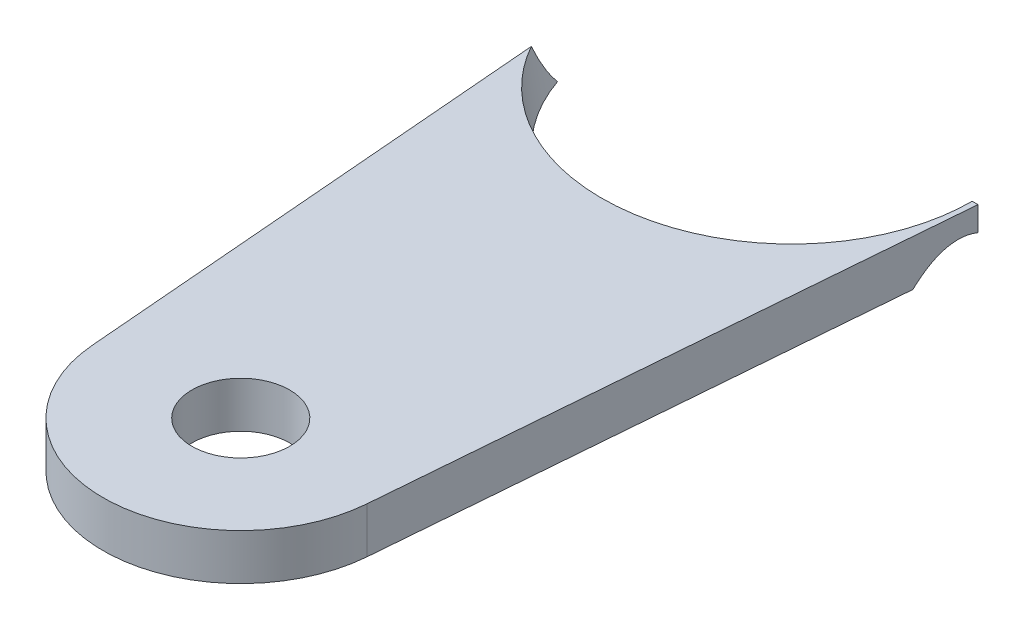
ISO-10303-21;
HEADER;
FILE_DESCRIPTION(('STEP AP214'),'2;1');
FILE_NAME('part.step','',(''),(''),'','','');
FILE_SCHEMA(('AUTOMOTIVE_DESIGN { 1 0 10303 214 1 1 1 1 }'));
ENDSEC;
DATA;
#1=APPLICATION_CONTEXT('core data for automotive mechanical design processes');
#2=APPLICATION_PROTOCOL_DEFINITION('international standard','automotive_design',2000,#1);
#3=PRODUCT_CONTEXT('',#1,'mechanical');
#4=PRODUCT('Part','Part','',(#3));
#5=PRODUCT_RELATED_PRODUCT_CATEGORY('part','',(#4));
#6=PRODUCT_DEFINITION_FORMATION('','',#4);
#7=PRODUCT_DEFINITION_CONTEXT('part definition',#1,'design');
#8=PRODUCT_DEFINITION('design','',#6,#7);
#9=PRODUCT_DEFINITION_SHAPE('','',#8);
#10=(LENGTH_UNIT() NAMED_UNIT(*) SI_UNIT(.MILLI.,.METRE.));
#11=(NAMED_UNIT(*) PLANE_ANGLE_UNIT() SI_UNIT($,.RADIAN.));
#12=(NAMED_UNIT(*) SI_UNIT($,.STERADIAN.) SOLID_ANGLE_UNIT());
#13=UNCERTAINTY_MEASURE_WITH_UNIT(LENGTH_MEASURE(1.E-05),#10,'distance_accuracy_value','');
#14=(GEOMETRIC_REPRESENTATION_CONTEXT(3) GLOBAL_UNCERTAINTY_ASSIGNED_CONTEXT((#13)) GLOBAL_UNIT_ASSIGNED_CONTEXT((#10,
#11,#12)) REPRESENTATION_CONTEXT('',''));
#15=CARTESIAN_POINT('',(0.,0.,0.));
#16=DIRECTION('',(0.,0.,1.));
#17=DIRECTION('',(1.,0.,0.));
#18=AXIS2_PLACEMENT_3D('',#15,#16,#17);
#19=CARTESIAN_POINT('',(0.,3.175,-38.2665732));
#20=DIRECTION('',(0.,0.,1.));
#21=DIRECTION('',(-1.,0.,0.));
#22=AXIS2_PLACEMENT_3D('',#19,#20,#21);
#23=PLANE('',#22);
#24=CARTESIAN_POINT('',(0.0470558137914412,-0.196820951831489,-38.2665732));
#25=DIRECTION('',(0.,0.,-1.));
#26=DIRECTION('',(0.232526162396845,-0.972590141735457,0.));
#27=AXIS2_PLACEMENT_3D('',#24,#25,#26);
#28=ELLIPSE('',#27,575.908131206146,12.7);
#29=CARTESIAN_POINT('',(12.7,1.49692016372004,-38.2665732));
#30=VERTEX_POINT('',#29);
#31=CARTESIAN_POINT('',(12.298835215549,3.175,-38.2665732));
#32=VERTEX_POINT('',#31);
#33=EDGE_CURVE('E11',#30,#32,#28,.F.);
#34=ORIENTED_EDGE('',*,*,#33,.T.);
#35=DIRECTION('',(1.,0.,0.));
#36=VECTOR('',#35,1.);
#37=CARTESIAN_POINT('',(0.,3.175,-38.2665732));
#38=LINE('',#37,#36);
#39=CARTESIAN_POINT('',(12.7,3.175,-38.2665732));
#40=VERTEX_POINT('',#39);
#41=EDGE_CURVE('E50',#32,#40,#38,.T.);
#42=ORIENTED_EDGE('',*,*,#41,.T.);
#43=DIRECTION('',(0.,-1.,0.));
#44=VECTOR('',#43,1.);
#45=CARTESIAN_POINT('',(12.7,3.175,-38.2665732));
#46=LINE('',#45,#44);
#47=EDGE_CURVE('E109',#40,#30,#46,.T.);
#48=ORIENTED_EDGE('',*,*,#47,.T.);
#49=EDGE_LOOP('',(#34,#42,#48));
#50=FACE_BOUND('',#49,.T.);
#51=ADVANCED_FACE('F47',(#50),#23,.F.);
#52=CARTESIAN_POINT('',(-9.49303504613389,3.175,0.779686227192671));
#53=DIRECTION('',(-0.996644099331641,0.,0.0818568217525113));
#54=DIRECTION('',(-0.0818568217525113,0.,-0.996644099331641));
#55=AXIS2_PLACEMENT_3D('',#52,#53,#54);
#56=PLANE('',#55);
#57=DIRECTION('',(0.0818568217525113,0.,0.996644099331641));
#58=VECTOR('',#57,1.);
#59=CARTESIAN_POINT('',(-9.49303504613389,0.,0.779686227192671));
#60=LINE('',#59,#58);
#61=CARTESIAN_POINT('',(-12.371838673831,0.,-34.2710595414799));
#62=VERTEX_POINT('',#61);
#63=CARTESIAN_POINT('',(-9.49303504613388,0.,0.779686227192673));
#64=VERTEX_POINT('',#63);
#65=EDGE_CURVE('E128',#62,#64,#60,.T.);
#66=ORIENTED_EDGE('',*,*,#65,.T.);
#67=DIRECTION('',(0.,-1.,0.));
#68=VECTOR('',#67,1.);
#69=CARTESIAN_POINT('',(-9.49303504613388,3.175,0.779686227192673));
#70=LINE('',#69,#68);
#71=CARTESIAN_POINT('',(-9.49303504613388,3.175,0.779686227192673));
#72=VERTEX_POINT('',#71);
#73=EDGE_CURVE('E132',#72,#64,#70,.T.);
#74=ORIENTED_EDGE('',*,*,#73,.F.);
#75=DIRECTION('',(0.0818568217525113,0.,0.996644099331641));
#76=VECTOR('',#75,1.);
#77=CARTESIAN_POINT('',(-9.49303504613389,3.175,0.779686227192671));
#78=LINE('',#77,#76);
#79=CARTESIAN_POINT('',(-12.2096075175305,3.175,-32.2958212999629));
#80=VERTEX_POINT('',#79);
#81=EDGE_CURVE('E123',#80,#72,#78,.T.);
#82=ORIENTED_EDGE('',*,*,#81,.F.);
#83=CARTESIAN_POINT('',(-12.8000934964319,53.5391141349132,-39.4852571222996));
#84=DIRECTION('',(0.996644099331641,0.,-0.0818568217525113));
#85=DIRECTION('',(0.00344910524056414,-0.999111891487616,0.0419944277384142));
#86=AXIS2_PLACEMENT_3D('',#83,#84,#85);
#87=ELLIPSE('',#86,55.2451687845276,12.7);
#88=EDGE_CURVE('E124',#62,#80,#87,.F.);
#89=ORIENTED_EDGE('',*,*,#88,.F.);
#90=EDGE_LOOP('',(#66,#74,#82,#89));
#91=FACE_BOUND('',#90,.T.);
#92=ADVANCED_FACE('F144',(#91),#56,.T.);
#93=CARTESIAN_POINT('',(9.49303504613389,3.175,0.779686227192673));
#94=DIRECTION('',(-0.996644099331641,0.,-0.0818568217525116));
#95=DIRECTION('',(0.0818568217525116,0.,-0.996644099331641));
#96=AXIS2_PLACEMENT_3D('',#93,#94,#95);
#97=PLANE('',#96);
#98=CARTESIAN_POINT('',(12.6021816889767,-52.711305896596,-37.0755906966395));
#99=DIRECTION('',(0.996644099331641,0.,0.0818568217525116));
#100=DIRECTION('',(-0.00024824963467083,-0.999995401263961,0.00302255240624862));
#101=AXIS2_PLACEMENT_3D('',#98,#99,#100);
#102=ELLIPSE('',#101,54.3909819607859,12.7);
#103=CARTESIAN_POINT('',(12.3582137734649,0.,-34.105170171931));
#104=VERTEX_POINT('',#103);
#105=EDGE_CURVE('E56',#104,#30,#102,.F.);
#106=ORIENTED_EDGE('',*,*,#105,.T.);
#107=ORIENTED_EDGE('',*,*,#47,.F.);
#108=DIRECTION('',(-0.0818568217525116,0.,0.996644099331641));
#109=VECTOR('',#108,1.);
#110=CARTESIAN_POINT('',(9.49303504613389,3.175,0.779686227192673));
#111=LINE('',#110,#109);
#112=CARTESIAN_POINT('',(9.49303504613388,3.175,0.779686227192675));
#113=VERTEX_POINT('',#112);
#114=EDGE_CURVE('E103',#40,#113,#111,.T.);
#115=ORIENTED_EDGE('',*,*,#114,.T.);
#116=DIRECTION('',(0.,-1.,0.));
#117=VECTOR('',#116,1.);
#118=CARTESIAN_POINT('',(9.49303504613388,3.175,0.779686227192675));
#119=LINE('',#118,#117);
#120=CARTESIAN_POINT('',(9.49303504613388,0.,0.779686227192675));
#121=VERTEX_POINT('',#120);
#122=EDGE_CURVE('E119',#113,#121,#119,.T.);
#123=ORIENTED_EDGE('',*,*,#122,.T.);
#124=DIRECTION('',(-0.0818568217525116,0.,0.996644099331641));
#125=VECTOR('',#124,1.);
#126=CARTESIAN_POINT('',(9.49303504613389,0.,0.779686227192673));
#127=LINE('',#126,#125);
#128=EDGE_CURVE('E114',#104,#121,#127,.T.);
#129=ORIENTED_EDGE('',*,*,#128,.F.);
#130=EDGE_LOOP('',(#106,#107,#115,#123,#129));
#131=FACE_BOUND('',#130,.T.);
#132=ADVANCED_FACE('F110',(#131),#97,.F.);
#133=CARTESIAN_POINT('',(0.,3.175,0.));
#134=DIRECTION('',(0.,-1.,0.));
#135=DIRECTION('',(0.,0.,1.));
#136=AXIS2_PLACEMENT_3D('',#133,#134,#135);
#137=CYLINDRICAL_SURFACE('',#136,9.525);
#138=CARTESIAN_POINT('',(0.,0.,0.));
#139=DIRECTION('',(0.,-1.,0.));
#140=DIRECTION('',(0.,0.,-1.));
#141=AXIS2_PLACEMENT_3D('',#138,#139,#140);
#142=CIRCLE('',#141,9.525);
#143=EDGE_CURVE('E113',#121,#64,#142,.T.);
#144=ORIENTED_EDGE('',*,*,#143,.F.);
#145=ORIENTED_EDGE('',*,*,#122,.F.);
#146=CARTESIAN_POINT('',(0.,3.175,0.));
#147=DIRECTION('',(0.,-1.,0.));
#148=DIRECTION('',(0.,0.,-1.));
#149=AXIS2_PLACEMENT_3D('',#146,#147,#148);
#150=CIRCLE('',#149,9.525);
#151=EDGE_CURVE('E100',#113,#72,#150,.T.);
#152=ORIENTED_EDGE('',*,*,#151,.T.);
#153=ORIENTED_EDGE('',*,*,#73,.T.);
#154=EDGE_LOOP('',(#144,#145,#152,#153));
#155=FACE_BOUND('',#154,.T.);
#156=ADVANCED_FACE('F140',(#155),#137,.T.);
#157=CARTESIAN_POINT('',(0.,3.175,0.));
#158=DIRECTION('',(0.,-1.,0.));
#159=DIRECTION('',(0.,0.,1.));
#160=AXIS2_PLACEMENT_3D('',#157,#158,#159);
#161=CYLINDRICAL_SURFACE('',#160,3.3782);
#162=CARTESIAN_POINT('',(0.,3.175,0.));
#163=DIRECTION('',(0.,-1.,0.));
#164=DIRECTION('',(0.,0.,-1.));
#165=AXIS2_PLACEMENT_3D('',#162,#163,#164);
#166=CIRCLE('',#165,3.3782);
#167=CARTESIAN_POINT('',(0.,3.175,-3.3782));
#168=VERTEX_POINT('',#167);
#169=EDGE_CURVE('E116',#168,#168,#166,.T.);
#170=ORIENTED_EDGE('',*,*,#169,.F.);
#171=EDGE_LOOP('',(#170));
#172=FACE_BOUND('',#171,.T.);
#173=CARTESIAN_POINT('',(0.,0.,0.));
#174=DIRECTION('',(0.,-1.,0.));
#175=DIRECTION('',(0.,0.,-1.));
#176=AXIS2_PLACEMENT_3D('',#173,#174,#175);
#177=CIRCLE('',#176,3.3782);
#178=CARTESIAN_POINT('',(0.,0.,-3.3782));
#179=VERTEX_POINT('',#178);
#180=EDGE_CURVE('E125',#179,#179,#177,.T.);
#181=ORIENTED_EDGE('',*,*,#180,.T.);
#182=EDGE_LOOP('',(#181));
#183=FACE_BOUND('',#182,.T.);
#184=ADVANCED_FACE('F166',(#172,#183),#161,.F.);
#185=CARTESIAN_POINT('',(0.,3.175,0.));
#186=DIRECTION('',(0.,1.,0.));
#187=DIRECTION('',(0.,0.,-1.));
#188=AXIS2_PLACEMENT_3D('',#185,#186,#187);
#189=PLANE('',#188);
#190=ORIENTED_EDGE('',*,*,#81,.T.);
#191=ORIENTED_EDGE('',*,*,#151,.F.);
#192=ORIENTED_EDGE('',*,*,#114,.F.);
#193=ORIENTED_EDGE('',*,*,#41,.F.);
#194=CARTESIAN_POINT('',(-0.759076751792299,3.17500000000001,-38.3430431446699));
#195=DIRECTION('',(0.,-1.,0.));
#196=DIRECTION('',(0.995530904295777,0.,0.0944363203012076));
#197=AXIS2_PLACEMENT_3D('',#194,#195,#196);
#198=ELLIPSE('',#197,13.0610917831724,12.7);
#199=EDGE_CURVE('E65',#80,#32,#198,.F.);
#200=ORIENTED_EDGE('',*,*,#199,.F.);
#201=EDGE_LOOP('',(#190,#191,#192,#193,#200));
#202=FACE_BOUND('',#201,.T.);
#203=ORIENTED_EDGE('',*,*,#169,.T.);
#204=EDGE_LOOP('',(#203));
#205=FACE_BOUND('',#204,.T.);
#206=ADVANCED_FACE('F104',(#202,#205),#189,.T.);
#207=CARTESIAN_POINT('',(0.,0.,0.));
#208=DIRECTION('',(0.,1.,0.));
#209=DIRECTION('',(0.,0.,-1.));
#210=AXIS2_PLACEMENT_3D('',#207,#208,#209);
#211=PLANE('',#210);
#212=CARTESIAN_POINT('',(-3.88578058618805E-12,0.,-38.2710369267255));
#213=DIRECTION('',(0.,-1.,0.));
#214=DIRECTION('',(0.995530904295777,0.,0.0944363203012076));
#215=AXIS2_PLACEMENT_3D('',#212,#213,#214);
#216=ELLIPSE('',#215,13.0610917831724,12.7);
#217=EDGE_CURVE('E84',#62,#104,#216,.F.);
#218=ORIENTED_EDGE('',*,*,#217,.T.);
#219=ORIENTED_EDGE('',*,*,#128,.T.);
#220=ORIENTED_EDGE('',*,*,#143,.T.);
#221=ORIENTED_EDGE('',*,*,#65,.F.);
#222=EDGE_LOOP('',(#218,#219,#220,#221));
#223=FACE_BOUND('',#222,.T.);
#224=ORIENTED_EDGE('',*,*,#180,.F.);
#225=EDGE_LOOP('',(#224));
#226=FACE_BOUND('',#225,.T.);
#227=ADVANCED_FACE('F145',(#223,#226),#211,.F.);
#228=CARTESIAN_POINT('',(-38.9257525352607,162.815241025706,-41.9635439282891));
#229=DIRECTION('',(0.232469617208077,-0.97235362945404,0.0220521283028283));
#230=DIRECTION('',(-0.0944363203012353,0.,0.995530904295775));
#231=AXIS2_PLACEMENT_3D('',#228,#229,#230);
#232=CYLINDRICAL_SURFACE('',#231,12.7);
#233=ORIENTED_EDGE('',*,*,#88,.T.);
#234=ORIENTED_EDGE('',*,*,#199,.T.);
#235=ORIENTED_EDGE('',*,*,#33,.F.);
#236=ORIENTED_EDGE('',*,*,#105,.F.);
#237=ORIENTED_EDGE('',*,*,#217,.F.);
#238=EDGE_LOOP('',(#233,#234,#235,#236,#237));
#239=FACE_BOUND('',#238,.T.);
#240=ADVANCED_FACE('F147',(#239),#232,.F.);
#241=CLOSED_SHELL('',(#51,#92,#132,#156,#184,#206,#227,#240));
#242=MANIFOLD_SOLID_BREP('B2',#241);
#243=ADVANCED_BREP_SHAPE_REPRESENTATION('',(#18,#242),#14);
#244=SHAPE_DEFINITION_REPRESENTATION(#9,#243);
ENDSEC;
END-ISO-10303-21;
